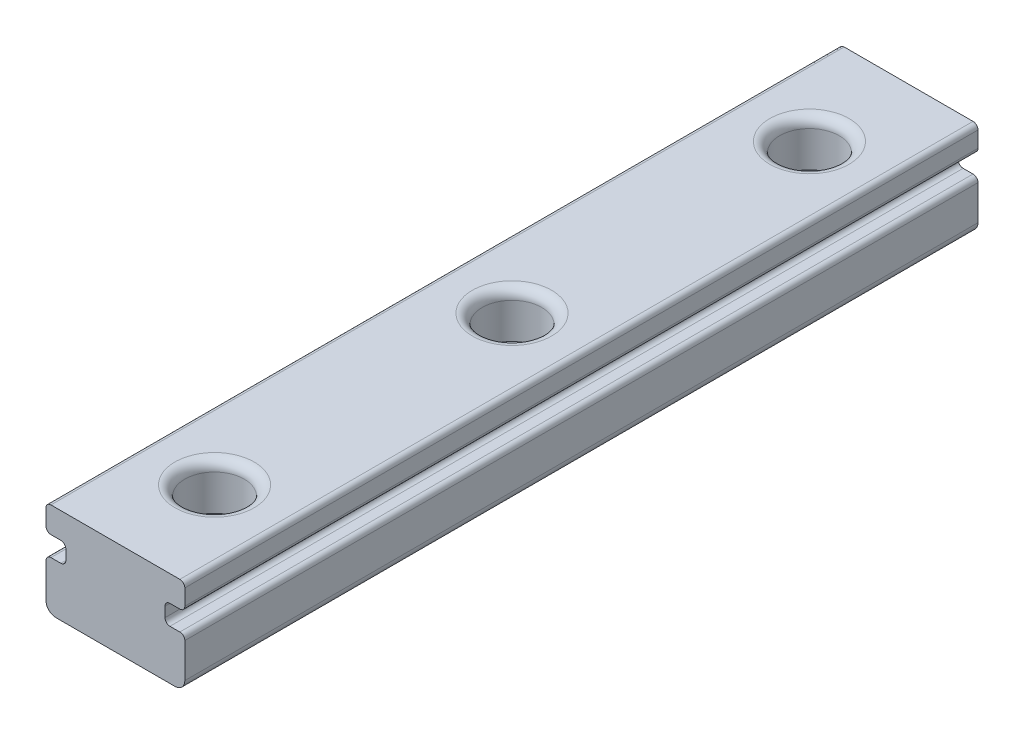
ISO-10303-21;
HEADER;
FILE_DESCRIPTION(('STEP AP214'),'2;1');
FILE_NAME('part.step','',(''),(''),'','','');
FILE_SCHEMA(('AUTOMOTIVE_DESIGN { 1 0 10303 214 1 1 1 1 }'));
ENDSEC;
DATA;
#1=APPLICATION_CONTEXT('core data for automotive mechanical design processes');
#2=APPLICATION_PROTOCOL_DEFINITION('international standard','automotive_design',2000,#1);
#3=PRODUCT_CONTEXT('',#1,'mechanical');
#4=PRODUCT('Part','Part','',(#3));
#5=PRODUCT_RELATED_PRODUCT_CATEGORY('part','',(#4));
#6=PRODUCT_DEFINITION_FORMATION('','',#4);
#7=PRODUCT_DEFINITION_CONTEXT('part definition',#1,'design');
#8=PRODUCT_DEFINITION('design','',#6,#7);
#9=PRODUCT_DEFINITION_SHAPE('','',#8);
#10=(LENGTH_UNIT() NAMED_UNIT(*) SI_UNIT(.MILLI.,.METRE.));
#11=(NAMED_UNIT(*) PLANE_ANGLE_UNIT() SI_UNIT($,.RADIAN.));
#12=(NAMED_UNIT(*) SI_UNIT($,.STERADIAN.) SOLID_ANGLE_UNIT());
#13=UNCERTAINTY_MEASURE_WITH_UNIT(LENGTH_MEASURE(1.E-05),#10,'distance_accuracy_value','');
#14=(GEOMETRIC_REPRESENTATION_CONTEXT(3) GLOBAL_UNCERTAINTY_ASSIGNED_CONTEXT((#13)) GLOBAL_UNIT_ASSIGNED_CONTEXT((#10,
#11,#12)) REPRESENTATION_CONTEXT('',''));
#15=CARTESIAN_POINT('',(0.,0.,0.));
#16=DIRECTION('',(0.,0.,1.));
#17=DIRECTION('',(1.,0.,0.));
#18=AXIS2_PLACEMENT_3D('',#15,#16,#17);
#19=CARTESIAN_POINT('',(3.5,0.,35.));
#20=DIRECTION('',(0.,1.,0.));
#21=DIRECTION('',(0.,0.,1.));
#22=AXIS2_PLACEMENT_3D('',#19,#20,#21);
#23=CYLINDRICAL_SURFACE('',#22,1.2);
#24=CARTESIAN_POINT('',(3.5,0.,35.));
#25=DIRECTION('',(0.,1.,0.));
#26=DIRECTION('',(0.,0.,1.));
#27=AXIS2_PLACEMENT_3D('',#24,#25,#26);
#28=CIRCLE('',#27,1.2);
#29=CARTESIAN_POINT('',(3.5,0.,36.2));
#30=VERTEX_POINT('',#29);
#31=EDGE_CURVE('E337',#30,#30,#28,.T.);
#32=ORIENTED_EDGE('',*,*,#31,.F.);
#33=EDGE_LOOP('',(#32));
#34=FACE_BOUND('',#33,.T.);
#35=CARTESIAN_POINT('',(3.5,2.5,35.));
#36=DIRECTION('',(0.,1.,0.));
#37=DIRECTION('',(0.,0.,1.));
#38=AXIS2_PLACEMENT_3D('',#35,#36,#37);
#39=CIRCLE('',#38,1.2);
#40=CARTESIAN_POINT('',(3.5,2.5,36.2));
#41=VERTEX_POINT('',#40);
#42=EDGE_CURVE('E11',#41,#41,#39,.T.);
#43=ORIENTED_EDGE('',*,*,#42,.T.);
#44=EDGE_LOOP('',(#43));
#45=FACE_BOUND('',#44,.T.);
#46=ADVANCED_FACE('F36',(#34,#45),#23,.F.);
#47=CARTESIAN_POINT('',(3.5,2.5,35.));
#48=DIRECTION('',(0.,1.,0.));
#49=DIRECTION('',(0.,0.,1.));
#50=AXIS2_PLACEMENT_3D('',#47,#48,#49);
#51=PLANE('',#50);
#52=ORIENTED_EDGE('',*,*,#42,.F.);
#53=EDGE_LOOP('',(#52));
#54=FACE_BOUND('',#53,.T.);
#55=CARTESIAN_POINT('',(3.5,2.5,35.));
#56=DIRECTION('',(0.,1.,0.));
#57=DIRECTION('',(0.,0.,1.));
#58=AXIS2_PLACEMENT_3D('',#55,#56,#57);
#59=CIRCLE('',#58,1.5);
#60=CARTESIAN_POINT('',(3.5,2.5,36.5));
#61=VERTEX_POINT('',#60);
#62=EDGE_CURVE('E43',#61,#61,#59,.T.);
#63=ORIENTED_EDGE('',*,*,#62,.T.);
#64=EDGE_LOOP('',(#63));
#65=FACE_BOUND('',#64,.T.);
#66=ADVANCED_FACE('F348',(#54,#65),#51,.T.);
#67=CARTESIAN_POINT('',(3.5,2.5,35.));
#68=DIRECTION('',(0.,1.,0.));
#69=DIRECTION('',(0.,0.,1.));
#70=AXIS2_PLACEMENT_3D('',#67,#68,#69);
#71=CYLINDRICAL_SURFACE('',#70,1.5);
#72=CARTESIAN_POINT('',(3.5,4.3,35.));
#73=DIRECTION('',(0.,1.,0.));
#74=DIRECTION('',(0.,0.,1.));
#75=AXIS2_PLACEMENT_3D('',#72,#73,#74);
#76=CIRCLE('',#75,1.5);
#77=CARTESIAN_POINT('',(3.5,4.3,36.5));
#78=VERTEX_POINT('',#77);
#79=EDGE_CURVE('E343',#78,#78,#76,.T.);
#80=ORIENTED_EDGE('',*,*,#79,.T.);
#81=EDGE_LOOP('',(#80));
#82=FACE_BOUND('',#81,.T.);
#83=ORIENTED_EDGE('',*,*,#62,.F.);
#84=EDGE_LOOP('',(#83));
#85=FACE_BOUND('',#84,.T.);
#86=ADVANCED_FACE('F350',(#82,#85),#71,.F.);
#87=CARTESIAN_POINT('',(3.5,4.3,35.));
#88=DIRECTION('',(0.,1.,0.));
#89=DIRECTION('',(0.,0.,1.));
#90=AXIS2_PLACEMENT_3D('',#87,#88,#89);
#91=TOROIDAL_SURFACE('',#90,2.,0.5);
#92=CARTESIAN_POINT('',(3.5,4.8,35.));
#93=DIRECTION('',(0.,1.,0.));
#94=DIRECTION('',(0.,0.,1.));
#95=AXIS2_PLACEMENT_3D('',#92,#93,#94);
#96=CIRCLE('',#95,2.);
#97=CARTESIAN_POINT('',(3.5,4.8,37.));
#98=VERTEX_POINT('',#97);
#99=EDGE_CURVE('E340',#98,#98,#96,.F.);
#100=ORIENTED_EDGE('',*,*,#99,.F.);
#101=EDGE_LOOP('',(#100));
#102=FACE_BOUND('',#101,.T.);
#103=ORIENTED_EDGE('',*,*,#79,.F.);
#104=EDGE_LOOP('',(#103));
#105=FACE_BOUND('',#104,.T.);
#106=ADVANCED_FACE('F352',(#102,#105),#91,.T.);
#107=CARTESIAN_POINT('',(7.,0.,40.));
#108=DIRECTION('',(1.,0.,0.));
#109=DIRECTION('',(0.,0.,-1.));
#110=AXIS2_PLACEMENT_3D('',#107,#108,#109);
#111=PLANE('',#110);
#112=DIRECTION('',(0.,-1.,0.));
#113=VECTOR('',#112,1.);
#114=CARTESIAN_POINT('',(7.,0.,40.));
#115=LINE('',#114,#113);
#116=CARTESIAN_POINT('',(7.,2.25,40.));
#117=VERTEX_POINT('',#116);
#118=CARTESIAN_POINT('',(7.,0.5,40.));
#119=VERTEX_POINT('',#118);
#120=EDGE_CURVE('E506',#117,#119,#115,.T.);
#121=ORIENTED_EDGE('',*,*,#120,.T.);
#122=DIRECTION('',(0.,0.,-1.));
#123=VECTOR('',#122,1.);
#124=CARTESIAN_POINT('',(7.,0.5,0.));
#125=LINE('',#124,#123);
#126=CARTESIAN_POINT('',(7.,0.5,0.));
#127=VERTEX_POINT('',#126);
#128=EDGE_CURVE('E328',#119,#127,#125,.T.);
#129=ORIENTED_EDGE('',*,*,#128,.T.);
#130=DIRECTION('',(0.,-1.,0.));
#131=VECTOR('',#130,1.);
#132=CARTESIAN_POINT('',(7.,0.,0.));
#133=LINE('',#132,#131);
#134=CARTESIAN_POINT('',(7.,2.25,0.));
#135=VERTEX_POINT('',#134);
#136=EDGE_CURVE('E222',#135,#127,#133,.T.);
#137=ORIENTED_EDGE('',*,*,#136,.F.);
#138=DIRECTION('',(0.,0.,-1.));
#139=VECTOR('',#138,1.);
#140=CARTESIAN_POINT('',(7.,2.25,40.));
#141=LINE('',#140,#139);
#142=EDGE_CURVE('E247',#135,#117,#141,.F.);
#143=ORIENTED_EDGE('',*,*,#142,.T.);
#144=EDGE_LOOP('',(#121,#129,#137,#143));
#145=FACE_BOUND('',#144,.T.);
#146=ADVANCED_FACE('F359',(#145),#111,.T.);
#147=CARTESIAN_POINT('',(0.,2.5,40.));
#148=DIRECTION('',(0.,1.,0.));
#149=DIRECTION('',(0.,0.,1.));
#150=AXIS2_PLACEMENT_3D('',#147,#148,#149);
#151=PLANE('',#150);
#152=DIRECTION('',(1.,0.,0.));
#153=VECTOR('',#152,1.);
#154=CARTESIAN_POINT('',(0.,2.5,40.));
#155=LINE('',#154,#153);
#156=CARTESIAN_POINT('',(6.25,2.5,40.));
#157=VERTEX_POINT('',#156);
#158=CARTESIAN_POINT('',(6.75,2.5,40.));
#159=VERTEX_POINT('',#158);
#160=EDGE_CURVE('E508',#157,#159,#155,.T.);
#161=ORIENTED_EDGE('',*,*,#160,.T.);
#162=DIRECTION('',(0.,0.,-1.));
#163=VECTOR('',#162,1.);
#164=CARTESIAN_POINT('',(6.75,2.5,40.));
#165=LINE('',#164,#163);
#166=CARTESIAN_POINT('',(6.75,2.5,0.));
#167=VERTEX_POINT('',#166);
#168=EDGE_CURVE('E221',#159,#167,#165,.T.);
#169=ORIENTED_EDGE('',*,*,#168,.T.);
#170=DIRECTION('',(1.,0.,0.));
#171=VECTOR('',#170,1.);
#172=CARTESIAN_POINT('',(0.,2.5,0.));
#173=LINE('',#172,#171);
#174=CARTESIAN_POINT('',(6.25,2.5,0.));
#175=VERTEX_POINT('',#174);
#176=EDGE_CURVE('E204',#175,#167,#173,.T.);
#177=ORIENTED_EDGE('',*,*,#176,.F.);
#178=DIRECTION('',(0.,0.,-1.));
#179=VECTOR('',#178,1.);
#180=CARTESIAN_POINT('',(6.25,2.5,40.));
#181=LINE('',#180,#179);
#182=EDGE_CURVE('E218',#175,#157,#181,.F.);
#183=ORIENTED_EDGE('',*,*,#182,.T.);
#184=EDGE_LOOP('',(#161,#169,#177,#183));
#185=FACE_BOUND('',#184,.T.);
#186=ADVANCED_FACE('F217',(#185),#151,.T.);
#187=CARTESIAN_POINT('',(6.,0.,40.));
#188=DIRECTION('',(1.,0.,0.));
#189=DIRECTION('',(0.,0.,-1.));
#190=AXIS2_PLACEMENT_3D('',#187,#188,#189);
#191=PLANE('',#190);
#192=DIRECTION('',(0.,-1.,0.));
#193=VECTOR('',#192,1.);
#194=CARTESIAN_POINT('',(6.,0.,40.));
#195=LINE('',#194,#193);
#196=CARTESIAN_POINT('',(6.,3.25,40.));
#197=VERTEX_POINT('',#196);
#198=CARTESIAN_POINT('',(6.,2.75,40.));
#199=VERTEX_POINT('',#198);
#200=EDGE_CURVE('E510',#197,#199,#195,.T.);
#201=ORIENTED_EDGE('',*,*,#200,.T.);
#202=DIRECTION('',(0.,0.,-1.));
#203=VECTOR('',#202,1.);
#204=CARTESIAN_POINT('',(6.,2.75,0.));
#205=LINE('',#204,#203);
#206=CARTESIAN_POINT('',(6.,2.75,0.));
#207=VERTEX_POINT('',#206);
#208=EDGE_CURVE('E281',#199,#207,#205,.T.);
#209=ORIENTED_EDGE('',*,*,#208,.T.);
#210=DIRECTION('',(0.,-1.,0.));
#211=VECTOR('',#210,1.);
#212=CARTESIAN_POINT('',(6.,0.,0.));
#213=LINE('',#212,#211);
#214=CARTESIAN_POINT('',(6.,3.25,0.));
#215=VERTEX_POINT('',#214);
#216=EDGE_CURVE('E206',#215,#207,#213,.T.);
#217=ORIENTED_EDGE('',*,*,#216,.F.);
#218=DIRECTION('',(0.,0.,-1.));
#219=VECTOR('',#218,1.);
#220=CARTESIAN_POINT('',(6.,3.25,40.));
#221=LINE('',#220,#219);
#222=EDGE_CURVE('E279',#215,#197,#221,.F.);
#223=ORIENTED_EDGE('',*,*,#222,.T.);
#224=EDGE_LOOP('',(#201,#209,#217,#223));
#225=FACE_BOUND('',#224,.T.);
#226=ADVANCED_FACE('F414',(#225),#191,.T.);
#227=CARTESIAN_POINT('',(0.,3.50000000000001,40.));
#228=DIRECTION('',(0.,-1.,0.));
#229=DIRECTION('',(1.,0.,0.));
#230=AXIS2_PLACEMENT_3D('',#227,#228,#229);
#231=PLANE('',#230);
#232=DIRECTION('',(-1.,0.,0.));
#233=VECTOR('',#232,1.);
#234=CARTESIAN_POINT('',(0.,3.50000000000001,40.));
#235=LINE('',#234,#233);
#236=CARTESIAN_POINT('',(6.75,3.5,40.));
#237=VERTEX_POINT('',#236);
#238=CARTESIAN_POINT('',(6.25,3.5,40.));
#239=VERTEX_POINT('',#238);
#240=EDGE_CURVE('E513',#237,#239,#235,.T.);
#241=ORIENTED_EDGE('',*,*,#240,.T.);
#242=DIRECTION('',(0.,0.,-1.));
#243=VECTOR('',#242,1.);
#244=CARTESIAN_POINT('',(6.25,3.5,0.));
#245=LINE('',#244,#243);
#246=CARTESIAN_POINT('',(6.25,3.5,0.));
#247=VERTEX_POINT('',#246);
#248=EDGE_CURVE('E285',#239,#247,#245,.T.);
#249=ORIENTED_EDGE('',*,*,#248,.T.);
#250=DIRECTION('',(-1.,0.,0.));
#251=VECTOR('',#250,1.);
#252=CARTESIAN_POINT('',(0.,3.50000000000001,0.));
#253=LINE('',#252,#251);
#254=CARTESIAN_POINT('',(6.75,3.5,0.));
#255=VERTEX_POINT('',#254);
#256=EDGE_CURVE('E536',#255,#247,#253,.T.);
#257=ORIENTED_EDGE('',*,*,#256,.F.);
#258=DIRECTION('',(0.,0.,-1.));
#259=VECTOR('',#258,1.);
#260=CARTESIAN_POINT('',(6.75,3.5,40.));
#261=LINE('',#260,#259);
#262=EDGE_CURVE('E283',#255,#237,#261,.F.);
#263=ORIENTED_EDGE('',*,*,#262,.T.);
#264=EDGE_LOOP('',(#241,#249,#257,#263));
#265=FACE_BOUND('',#264,.T.);
#266=ADVANCED_FACE('F410',(#265),#231,.T.);
#267=CARTESIAN_POINT('',(7.,0.,40.));
#268=DIRECTION('',(1.,0.,0.));
#269=DIRECTION('',(0.,0.,-1.));
#270=AXIS2_PLACEMENT_3D('',#267,#268,#269);
#271=PLANE('',#270);
#272=DIRECTION('',(0.,-1.,0.));
#273=VECTOR('',#272,1.);
#274=CARTESIAN_POINT('',(7.,0.,0.));
#275=LINE('',#274,#273);
#276=CARTESIAN_POINT('',(7.,4.55,0.));
#277=VERTEX_POINT('',#276);
#278=CARTESIAN_POINT('',(7.,3.75,0.));
#279=VERTEX_POINT('',#278);
#280=EDGE_CURVE('E539',#277,#279,#275,.T.);
#281=ORIENTED_EDGE('',*,*,#280,.F.);
#282=DIRECTION('',(0.,0.,-1.));
#283=VECTOR('',#282,1.);
#284=CARTESIAN_POINT('',(7.,4.55,40.));
#285=LINE('',#284,#283);
#286=CARTESIAN_POINT('',(7.,4.55,40.));
#287=VERTEX_POINT('',#286);
#288=EDGE_CURVE('E296',#277,#287,#285,.F.);
#289=ORIENTED_EDGE('',*,*,#288,.T.);
#290=DIRECTION('',(0.,-1.,0.));
#291=VECTOR('',#290,1.);
#292=CARTESIAN_POINT('',(7.,0.,40.));
#293=LINE('',#292,#291);
#294=CARTESIAN_POINT('',(7.,3.75,40.));
#295=VERTEX_POINT('',#294);
#296=EDGE_CURVE('E516',#287,#295,#293,.T.);
#297=ORIENTED_EDGE('',*,*,#296,.T.);
#298=DIRECTION('',(0.,0.,-1.));
#299=VECTOR('',#298,1.);
#300=CARTESIAN_POINT('',(7.,3.75,40.));
#301=LINE('',#300,#299);
#302=EDGE_CURVE('E293',#295,#279,#301,.T.);
#303=ORIENTED_EDGE('',*,*,#302,.T.);
#304=EDGE_LOOP('',(#281,#289,#297,#303));
#305=FACE_BOUND('',#304,.T.);
#306=ADVANCED_FACE('F406',(#305),#271,.T.);
#307=CARTESIAN_POINT('',(0.,4.8,40.));
#308=DIRECTION('',(0.,1.,0.));
#309=DIRECTION('',(0.,0.,1.));
#310=AXIS2_PLACEMENT_3D('',#307,#308,#309);
#311=PLANE('',#310);
#312=CARTESIAN_POINT('',(3.5,4.8,20.));
#313=DIRECTION('',(0.,1.,0.));
#314=DIRECTION('',(0.,0.,1.));
#315=AXIS2_PLACEMENT_3D('',#312,#313,#314);
#316=CIRCLE('',#315,2.);
#317=CARTESIAN_POINT('',(3.5,4.8,22.));
#318=VERTEX_POINT('',#317);
#319=EDGE_CURVE('E623',#318,#318,#316,.F.);
#320=ORIENTED_EDGE('',*,*,#319,.T.);
#321=EDGE_LOOP('',(#320));
#322=FACE_BOUND('',#321,.T.);
#323=CARTESIAN_POINT('',(3.5,4.8,5.));
#324=DIRECTION('',(0.,1.,0.));
#325=DIRECTION('',(0.,0.,1.));
#326=AXIS2_PLACEMENT_3D('',#323,#324,#325);
#327=CIRCLE('',#326,2.);
#328=CARTESIAN_POINT('',(3.5,4.8,7.));
#329=VERTEX_POINT('',#328);
#330=EDGE_CURVE('E334',#329,#329,#327,.F.);
#331=ORIENTED_EDGE('',*,*,#330,.T.);
#332=EDGE_LOOP('',(#331));
#333=FACE_BOUND('',#332,.T.);
#334=DIRECTION('',(1.,0.,0.));
#335=VECTOR('',#334,1.);
#336=CARTESIAN_POINT('',(0.,4.8,40.));
#337=LINE('',#336,#335);
#338=CARTESIAN_POINT('',(0.25,4.8,40.));
#339=VERTEX_POINT('',#338);
#340=CARTESIAN_POINT('',(6.75,4.8,40.));
#341=VERTEX_POINT('',#340);
#342=EDGE_CURVE('E519',#339,#341,#337,.T.);
#343=ORIENTED_EDGE('',*,*,#342,.T.);
#344=DIRECTION('',(0.,0.,-1.));
#345=VECTOR('',#344,1.);
#346=CARTESIAN_POINT('',(6.75,4.8,40.));
#347=LINE('',#346,#345);
#348=CARTESIAN_POINT('',(6.75,4.8,0.));
#349=VERTEX_POINT('',#348);
#350=EDGE_CURVE('E290',#341,#349,#347,.T.);
#351=ORIENTED_EDGE('',*,*,#350,.T.);
#352=DIRECTION('',(1.,0.,0.));
#353=VECTOR('',#352,1.);
#354=CARTESIAN_POINT('',(0.,4.8,0.));
#355=LINE('',#354,#353);
#356=CARTESIAN_POINT('',(0.25,4.8,0.));
#357=VERTEX_POINT('',#356);
#358=EDGE_CURVE('E542',#357,#349,#355,.T.);
#359=ORIENTED_EDGE('',*,*,#358,.F.);
#360=DIRECTION('',(0.,0.,-1.));
#361=VECTOR('',#360,1.);
#362=CARTESIAN_POINT('',(0.25,4.8,40.));
#363=LINE('',#362,#361);
#364=EDGE_CURVE('E288',#357,#339,#363,.F.);
#365=ORIENTED_EDGE('',*,*,#364,.T.);
#366=EDGE_LOOP('',(#343,#351,#359,#365));
#367=FACE_BOUND('',#366,.T.);
#368=ORIENTED_EDGE('',*,*,#99,.T.);
#369=EDGE_LOOP('',(#368));
#370=FACE_BOUND('',#369,.T.);
#371=ADVANCED_FACE('F402',(#322,#333,#367,#370),#311,.T.);
#372=CARTESIAN_POINT('',(0.,0.,40.));
#373=DIRECTION('',(-1.,0.,0.));
#374=DIRECTION('',(0.,0.,1.));
#375=AXIS2_PLACEMENT_3D('',#372,#373,#374);
#376=PLANE('',#375);
#377=DIRECTION('',(0.,1.,0.));
#378=VECTOR('',#377,1.);
#379=CARTESIAN_POINT('',(0.,0.,40.));
#380=LINE('',#379,#378);
#381=CARTESIAN_POINT('',(0.,3.75,40.));
#382=VERTEX_POINT('',#381);
#383=CARTESIAN_POINT('',(0.,4.55,40.));
#384=VERTEX_POINT('',#383);
#385=EDGE_CURVE('E522',#382,#384,#380,.T.);
#386=ORIENTED_EDGE('',*,*,#385,.T.);
#387=DIRECTION('',(0.,0.,-1.));
#388=VECTOR('',#387,1.);
#389=CARTESIAN_POINT('',(0.,4.55,40.));
#390=LINE('',#389,#388);
#391=CARTESIAN_POINT('',(0.,4.55,0.));
#392=VERTEX_POINT('',#391);
#393=EDGE_CURVE('E300',#384,#392,#390,.T.);
#394=ORIENTED_EDGE('',*,*,#393,.T.);
#395=DIRECTION('',(0.,1.,0.));
#396=VECTOR('',#395,1.);
#397=CARTESIAN_POINT('',(0.,0.,0.));
#398=LINE('',#397,#396);
#399=CARTESIAN_POINT('',(0.,3.75,0.));
#400=VERTEX_POINT('',#399);
#401=EDGE_CURVE('E545',#400,#392,#398,.T.);
#402=ORIENTED_EDGE('',*,*,#401,.F.);
#403=DIRECTION('',(0.,0.,-1.));
#404=VECTOR('',#403,1.);
#405=CARTESIAN_POINT('',(0.,3.75,40.));
#406=LINE('',#405,#404);
#407=EDGE_CURVE('E298',#400,#382,#406,.F.);
#408=ORIENTED_EDGE('',*,*,#407,.T.);
#409=EDGE_LOOP('',(#386,#394,#402,#408));
#410=FACE_BOUND('',#409,.T.);
#411=ADVANCED_FACE('F398',(#410),#376,.T.);
#412=CARTESIAN_POINT('',(0.,3.5,40.));
#413=DIRECTION('',(0.,-1.,0.));
#414=DIRECTION('',(0.,0.,-1.));
#415=AXIS2_PLACEMENT_3D('',#412,#413,#414);
#416=PLANE('',#415);
#417=DIRECTION('',(-1.,0.,0.));
#418=VECTOR('',#417,1.);
#419=CARTESIAN_POINT('',(0.,3.5,0.));
#420=LINE('',#419,#418);
#421=CARTESIAN_POINT('',(0.75,3.5,0.));
#422=VERTEX_POINT('',#421);
#423=CARTESIAN_POINT('',(0.25,3.5,0.));
#424=VERTEX_POINT('',#423);
#425=EDGE_CURVE('E548',#422,#424,#420,.T.);
#426=ORIENTED_EDGE('',*,*,#425,.F.);
#427=DIRECTION('',(0.,0.,-1.));
#428=VECTOR('',#427,1.);
#429=CARTESIAN_POINT('',(0.75,3.5,40.));
#430=LINE('',#429,#428);
#431=CARTESIAN_POINT('',(0.75,3.5,40.));
#432=VERTEX_POINT('',#431);
#433=EDGE_CURVE('E277',#422,#432,#430,.F.);
#434=ORIENTED_EDGE('',*,*,#433,.T.);
#435=DIRECTION('',(-1.,0.,0.));
#436=VECTOR('',#435,1.);
#437=CARTESIAN_POINT('',(0.,3.5,40.));
#438=LINE('',#437,#436);
#439=CARTESIAN_POINT('',(0.25,3.5,40.));
#440=VERTEX_POINT('',#439);
#441=EDGE_CURVE('E525',#432,#440,#438,.T.);
#442=ORIENTED_EDGE('',*,*,#441,.T.);
#443=DIRECTION('',(0.,0.,-1.));
#444=VECTOR('',#443,1.);
#445=CARTESIAN_POINT('',(0.25,3.5,40.));
#446=LINE('',#445,#444);
#447=EDGE_CURVE('E274',#440,#424,#446,.T.);
#448=ORIENTED_EDGE('',*,*,#447,.T.);
#449=EDGE_LOOP('',(#426,#434,#442,#448));
#450=FACE_BOUND('',#449,.T.);
#451=ADVANCED_FACE('F394',(#450),#416,.T.);
#452=CARTESIAN_POINT('',(1.,0.,40.));
#453=DIRECTION('',(-1.,0.,0.));
#454=DIRECTION('',(0.,0.,1.));
#455=AXIS2_PLACEMENT_3D('',#452,#453,#454);
#456=PLANE('',#455);
#457=DIRECTION('',(0.,1.,0.));
#458=VECTOR('',#457,1.);
#459=CARTESIAN_POINT('',(1.,0.,40.));
#460=LINE('',#459,#458);
#461=CARTESIAN_POINT('',(1.,2.75,40.));
#462=VERTEX_POINT('',#461);
#463=CARTESIAN_POINT('',(1.,3.25,40.));
#464=VERTEX_POINT('',#463);
#465=EDGE_CURVE('E528',#462,#464,#460,.T.);
#466=ORIENTED_EDGE('',*,*,#465,.T.);
#467=DIRECTION('',(0.,0.,-1.));
#468=VECTOR('',#467,1.);
#469=CARTESIAN_POINT('',(1.,3.25,0.));
#470=LINE('',#469,#468);
#471=CARTESIAN_POINT('',(1.,3.25,0.));
#472=VERTEX_POINT('',#471);
#473=EDGE_CURVE('E271',#464,#472,#470,.T.);
#474=ORIENTED_EDGE('',*,*,#473,.T.);
#475=DIRECTION('',(0.,1.,0.));
#476=VECTOR('',#475,1.);
#477=CARTESIAN_POINT('',(1.,0.,0.));
#478=LINE('',#477,#476);
#479=CARTESIAN_POINT('',(1.,2.75,0.));
#480=VERTEX_POINT('',#479);
#481=EDGE_CURVE('E551',#480,#472,#478,.T.);
#482=ORIENTED_EDGE('',*,*,#481,.F.);
#483=DIRECTION('',(0.,0.,-1.));
#484=VECTOR('',#483,1.);
#485=CARTESIAN_POINT('',(1.,2.75,40.));
#486=LINE('',#485,#484);
#487=EDGE_CURVE('E269',#480,#462,#486,.F.);
#488=ORIENTED_EDGE('',*,*,#487,.T.);
#489=EDGE_LOOP('',(#466,#474,#482,#488));
#490=FACE_BOUND('',#489,.T.);
#491=ADVANCED_FACE('F390',(#490),#456,.T.);
#492=CARTESIAN_POINT('',(0.,2.5,40.));
#493=DIRECTION('',(0.,1.,0.));
#494=DIRECTION('',(0.,0.,1.));
#495=AXIS2_PLACEMENT_3D('',#492,#493,#494);
#496=PLANE('',#495);
#497=DIRECTION('',(1.,0.,0.));
#498=VECTOR('',#497,1.);
#499=CARTESIAN_POINT('',(0.,2.5,0.));
#500=LINE('',#499,#498);
#501=CARTESIAN_POINT('',(0.25,2.5,0.));
#502=VERTEX_POINT('',#501);
#503=CARTESIAN_POINT('',(0.75,2.5,0.));
#504=VERTEX_POINT('',#503);
#505=EDGE_CURVE('E554',#502,#504,#500,.T.);
#506=ORIENTED_EDGE('',*,*,#505,.F.);
#507=DIRECTION('',(0.,0.,-1.));
#508=VECTOR('',#507,1.);
#509=CARTESIAN_POINT('',(0.25,2.5,40.));
#510=LINE('',#509,#508);
#511=CARTESIAN_POINT('',(0.25,2.5,40.));
#512=VERTEX_POINT('',#511);
#513=EDGE_CURVE('E267',#502,#512,#510,.F.);
#514=ORIENTED_EDGE('',*,*,#513,.T.);
#515=DIRECTION('',(1.,0.,0.));
#516=VECTOR('',#515,1.);
#517=CARTESIAN_POINT('',(0.,2.5,40.));
#518=LINE('',#517,#516);
#519=CARTESIAN_POINT('',(0.75,2.5,40.));
#520=VERTEX_POINT('',#519);
#521=EDGE_CURVE('E531',#512,#520,#518,.T.);
#522=ORIENTED_EDGE('',*,*,#521,.T.);
#523=DIRECTION('',(0.,0.,-1.));
#524=VECTOR('',#523,1.);
#525=CARTESIAN_POINT('',(0.75,2.5,0.));
#526=LINE('',#525,#524);
#527=EDGE_CURVE('E264',#520,#504,#526,.T.);
#528=ORIENTED_EDGE('',*,*,#527,.T.);
#529=EDGE_LOOP('',(#506,#514,#522,#528));
#530=FACE_BOUND('',#529,.T.);
#531=ADVANCED_FACE('F382',(#530),#496,.T.);
#532=CARTESIAN_POINT('',(0.,0.,40.));
#533=DIRECTION('',(1.,0.,0.));
#534=DIRECTION('',(0.,1.,0.));
#535=AXIS2_PLACEMENT_3D('',#532,#533,#534);
#536=PLANE('',#535);
#537=DIRECTION('',(0.,-1.,0.));
#538=VECTOR('',#537,1.);
#539=CARTESIAN_POINT('',(0.,0.,0.));
#540=LINE('',#539,#538);
#541=CARTESIAN_POINT('',(0.,2.25,0.));
#542=VERTEX_POINT('',#541);
#543=CARTESIAN_POINT('',(0.,0.5,0.));
#544=VERTEX_POINT('',#543);
#545=EDGE_CURVE('E556',#542,#544,#540,.T.);
#546=ORIENTED_EDGE('',*,*,#545,.T.);
#547=DIRECTION('',(0.,0.,-1.));
#548=VECTOR('',#547,1.);
#549=CARTESIAN_POINT('',(0.,0.5,40.));
#550=LINE('',#549,#548);
#551=CARTESIAN_POINT('',(0.,0.5,40.));
#552=VERTEX_POINT('',#551);
#553=EDGE_CURVE('E58',#544,#552,#550,.F.);
#554=ORIENTED_EDGE('',*,*,#553,.T.);
#555=DIRECTION('',(0.,-1.,0.));
#556=VECTOR('',#555,1.);
#557=CARTESIAN_POINT('',(0.,0.,40.));
#558=LINE('',#557,#556);
#559=CARTESIAN_POINT('',(0.,2.25,40.));
#560=VERTEX_POINT('',#559);
#561=EDGE_CURVE('E230',#560,#552,#558,.T.);
#562=ORIENTED_EDGE('',*,*,#561,.F.);
#563=DIRECTION('',(0.,0.,-1.));
#564=VECTOR('',#563,1.);
#565=CARTESIAN_POINT('',(0.,2.25,0.));
#566=LINE('',#565,#564);
#567=EDGE_CURVE('E261',#560,#542,#566,.T.);
#568=ORIENTED_EDGE('',*,*,#567,.T.);
#569=EDGE_LOOP('',(#546,#554,#562,#568));
#570=FACE_BOUND('',#569,.T.);
#571=ADVANCED_FACE('F374',(#570),#536,.F.);
#572=CARTESIAN_POINT('',(0.,0.,40.));
#573=DIRECTION('',(0.,1.,0.));
#574=DIRECTION('',(0.,0.,1.));
#575=AXIS2_PLACEMENT_3D('',#572,#573,#574);
#576=PLANE('',#575);
#577=CARTESIAN_POINT('',(3.5,0.,20.));
#578=DIRECTION('',(0.,1.,0.));
#579=DIRECTION('',(0.,0.,1.));
#580=AXIS2_PLACEMENT_3D('',#577,#578,#579);
#581=CIRCLE('',#580,1.2);
#582=CARTESIAN_POINT('',(3.5,0.,21.2));
#583=VERTEX_POINT('',#582);
#584=EDGE_CURVE('E626',#583,#583,#581,.T.);
#585=ORIENTED_EDGE('',*,*,#584,.T.);
#586=EDGE_LOOP('',(#585));
#587=FACE_BOUND('',#586,.T.);
#588=CARTESIAN_POINT('',(3.5,0.,5.));
#589=DIRECTION('',(0.,1.,0.));
#590=DIRECTION('',(0.,0.,1.));
#591=AXIS2_PLACEMENT_3D('',#588,#589,#590);
#592=CIRCLE('',#591,1.2);
#593=CARTESIAN_POINT('',(3.5,0.,6.2));
#594=VERTEX_POINT('',#593);
#595=EDGE_CURVE('E497',#594,#594,#592,.T.);
#596=ORIENTED_EDGE('',*,*,#595,.T.);
#597=EDGE_LOOP('',(#596));
#598=FACE_BOUND('',#597,.T.);
#599=DIRECTION('',(1.,0.,0.));
#600=VECTOR('',#599,1.);
#601=CARTESIAN_POINT('',(0.,0.,40.));
#602=LINE('',#601,#600);
#603=CARTESIAN_POINT('',(0.5,0.,40.));
#604=VERTEX_POINT('',#603);
#605=CARTESIAN_POINT('',(6.5,0.,40.));
#606=VERTEX_POINT('',#605);
#607=EDGE_CURVE('E226',#604,#606,#602,.T.);
#608=ORIENTED_EDGE('',*,*,#607,.F.);
#609=DIRECTION('',(0.,0.,-1.));
#610=VECTOR('',#609,1.);
#611=CARTESIAN_POINT('',(0.5,0.,40.));
#612=LINE('',#611,#610);
#613=CARTESIAN_POINT('',(0.5,0.,0.));
#614=VERTEX_POINT('',#613);
#615=EDGE_CURVE('E317',#604,#614,#612,.T.);
#616=ORIENTED_EDGE('',*,*,#615,.T.);
#617=DIRECTION('',(1.,0.,0.));
#618=VECTOR('',#617,1.);
#619=CARTESIAN_POINT('',(0.,0.,0.));
#620=LINE('',#619,#618);
#621=CARTESIAN_POINT('',(6.5,0.,0.));
#622=VERTEX_POINT('',#621);
#623=EDGE_CURVE('E233',#614,#622,#620,.T.);
#624=ORIENTED_EDGE('',*,*,#623,.T.);
#625=DIRECTION('',(0.,0.,-1.));
#626=VECTOR('',#625,1.);
#627=CARTESIAN_POINT('',(6.5,0.,40.));
#628=LINE('',#627,#626);
#629=EDGE_CURVE('E315',#622,#606,#628,.F.);
#630=ORIENTED_EDGE('',*,*,#629,.T.);
#631=EDGE_LOOP('',(#608,#616,#624,#630));
#632=FACE_BOUND('',#631,.T.);
#633=ORIENTED_EDGE('',*,*,#31,.T.);
#634=EDGE_LOOP('',(#633));
#635=FACE_BOUND('',#634,.T.);
#636=ADVANCED_FACE('F371',(#587,#598,#632,#635),#576,.F.);
#637=CARTESIAN_POINT('',(0.,0.,40.));
#638=DIRECTION('',(0.,0.,1.));
#639=DIRECTION('',(1.,0.,0.));
#640=AXIS2_PLACEMENT_3D('',#637,#638,#639);
#641=PLANE('',#640);
#642=ORIENTED_EDGE('',*,*,#561,.T.);
#643=CARTESIAN_POINT('',(0.5,0.5,40.));
#644=DIRECTION('',(0.,0.,1.));
#645=DIRECTION('',(1.,0.,0.));
#646=AXIS2_PLACEMENT_3D('',#643,#644,#645);
#647=CIRCLE('',#646,0.5);
#648=EDGE_CURVE('E326',#552,#604,#647,.T.);
#649=ORIENTED_EDGE('',*,*,#648,.T.);
#650=ORIENTED_EDGE('',*,*,#607,.T.);
#651=CARTESIAN_POINT('',(6.5,0.5,40.));
#652=DIRECTION('',(0.,0.,1.));
#653=DIRECTION('',(1.,0.,0.));
#654=AXIS2_PLACEMENT_3D('',#651,#652,#653);
#655=CIRCLE('',#654,0.5);
#656=EDGE_CURVE('E50',#606,#119,#655,.T.);
#657=ORIENTED_EDGE('',*,*,#656,.T.);
#658=ORIENTED_EDGE('',*,*,#120,.F.);
#659=CARTESIAN_POINT('',(6.75,2.25,40.));
#660=DIRECTION('',(0.,0.,1.));
#661=DIRECTION('',(1.,0.,0.));
#662=AXIS2_PLACEMENT_3D('',#659,#660,#661);
#663=CIRCLE('',#662,0.25);
#664=EDGE_CURVE('E259',#117,#159,#663,.T.);
#665=ORIENTED_EDGE('',*,*,#664,.T.);
#666=ORIENTED_EDGE('',*,*,#160,.F.);
#667=CARTESIAN_POINT('',(6.25,2.75,40.));
#668=DIRECTION('',(0.,0.,1.));
#669=DIRECTION('',(1.,0.,0.));
#670=AXIS2_PLACEMENT_3D('',#667,#668,#669);
#671=CIRCLE('',#670,0.25);
#672=EDGE_CURVE('E211',#157,#199,#671,.F.);
#673=ORIENTED_EDGE('',*,*,#672,.T.);
#674=ORIENTED_EDGE('',*,*,#200,.F.);
#675=CARTESIAN_POINT('',(6.25,3.25,40.));
#676=DIRECTION('',(0.,0.,1.));
#677=DIRECTION('',(1.,0.,0.));
#678=AXIS2_PLACEMENT_3D('',#675,#676,#677);
#679=CIRCLE('',#678,0.25);
#680=EDGE_CURVE('E313',#197,#239,#679,.F.);
#681=ORIENTED_EDGE('',*,*,#680,.T.);
#682=ORIENTED_EDGE('',*,*,#240,.F.);
#683=CARTESIAN_POINT('',(6.75,3.75,40.));
#684=DIRECTION('',(0.,0.,1.));
#685=DIRECTION('',(1.,0.,0.));
#686=AXIS2_PLACEMENT_3D('',#683,#684,#685);
#687=CIRCLE('',#686,0.25);
#688=EDGE_CURVE('E249',#237,#295,#687,.T.);
#689=ORIENTED_EDGE('',*,*,#688,.T.);
#690=ORIENTED_EDGE('',*,*,#296,.F.);
#691=CARTESIAN_POINT('',(6.75,4.55,40.));
#692=DIRECTION('',(0.,0.,1.));
#693=DIRECTION('',(1.,0.,0.));
#694=AXIS2_PLACEMENT_3D('',#691,#692,#693);
#695=CIRCLE('',#694,0.25);
#696=EDGE_CURVE('E255',#287,#341,#695,.T.);
#697=ORIENTED_EDGE('',*,*,#696,.T.);
#698=ORIENTED_EDGE('',*,*,#342,.F.);
#699=CARTESIAN_POINT('',(0.25,4.55,40.));
#700=DIRECTION('',(0.,0.,1.));
#701=DIRECTION('',(1.,0.,0.));
#702=AXIS2_PLACEMENT_3D('',#699,#700,#701);
#703=CIRCLE('',#702,0.25);
#704=EDGE_CURVE('E253',#339,#384,#703,.T.);
#705=ORIENTED_EDGE('',*,*,#704,.T.);
#706=ORIENTED_EDGE('',*,*,#385,.F.);
#707=CARTESIAN_POINT('',(0.25,3.75,40.));
#708=DIRECTION('',(0.,0.,1.));
#709=DIRECTION('',(1.,0.,0.));
#710=AXIS2_PLACEMENT_3D('',#707,#708,#709);
#711=CIRCLE('',#710,0.25);
#712=EDGE_CURVE('E251',#382,#440,#711,.T.);
#713=ORIENTED_EDGE('',*,*,#712,.T.);
#714=ORIENTED_EDGE('',*,*,#441,.F.);
#715=CARTESIAN_POINT('',(0.75,3.25,40.));
#716=DIRECTION('',(0.,0.,1.));
#717=DIRECTION('',(1.,0.,0.));
#718=AXIS2_PLACEMENT_3D('',#715,#716,#717);
#719=CIRCLE('',#718,0.25);
#720=EDGE_CURVE('E305',#432,#464,#719,.F.);
#721=ORIENTED_EDGE('',*,*,#720,.T.);
#722=ORIENTED_EDGE('',*,*,#465,.F.);
#723=CARTESIAN_POINT('',(0.75,2.75,40.));
#724=DIRECTION('',(0.,0.,1.));
#725=DIRECTION('',(1.,0.,0.));
#726=AXIS2_PLACEMENT_3D('',#723,#724,#725);
#727=CIRCLE('',#726,0.25);
#728=EDGE_CURVE('E212',#462,#520,#727,.F.);
#729=ORIENTED_EDGE('',*,*,#728,.T.);
#730=ORIENTED_EDGE('',*,*,#521,.F.);
#731=CARTESIAN_POINT('',(0.25,2.25,40.));
#732=DIRECTION('',(0.,0.,1.));
#733=DIRECTION('',(1.,0.,0.));
#734=AXIS2_PLACEMENT_3D('',#731,#732,#733);
#735=CIRCLE('',#734,0.25);
#736=EDGE_CURVE('E257',#512,#560,#735,.T.);
#737=ORIENTED_EDGE('',*,*,#736,.T.);
#738=EDGE_LOOP('',(#642,#649,#650,#657,#658,#665,#666,#673,#674,#681,#682,#689,#690,#697,#698,
#705,#706,#713,#714,#721,#722,#729,#730,#737));
#739=FACE_BOUND('',#738,.T.);
#740=ADVANCED_FACE('F373',(#739),#641,.T.);
#741=CARTESIAN_POINT('',(0.,0.,0.));
#742=DIRECTION('',(0.,0.,1.));
#743=DIRECTION('',(1.,0.,0.));
#744=AXIS2_PLACEMENT_3D('',#741,#742,#743);
#745=PLANE('',#744);
#746=ORIENTED_EDGE('',*,*,#623,.F.);
#747=CARTESIAN_POINT('',(0.5,0.5,0.));
#748=DIRECTION('',(0.,0.,1.));
#749=DIRECTION('',(1.,0.,0.));
#750=AXIS2_PLACEMENT_3D('',#747,#748,#749);
#751=CIRCLE('',#750,0.5);
#752=EDGE_CURVE('E322',#614,#544,#751,.F.);
#753=ORIENTED_EDGE('',*,*,#752,.T.);
#754=ORIENTED_EDGE('',*,*,#545,.F.);
#755=CARTESIAN_POINT('',(0.25,2.25,0.));
#756=DIRECTION('',(0.,0.,1.));
#757=DIRECTION('',(1.,0.,0.));
#758=AXIS2_PLACEMENT_3D('',#755,#756,#757);
#759=CIRCLE('',#758,0.25);
#760=EDGE_CURVE('E243',#542,#502,#759,.F.);
#761=ORIENTED_EDGE('',*,*,#760,.T.);
#762=ORIENTED_EDGE('',*,*,#505,.T.);
#763=CARTESIAN_POINT('',(0.75,2.75,0.));
#764=DIRECTION('',(0.,0.,1.));
#765=DIRECTION('',(1.,0.,0.));
#766=AXIS2_PLACEMENT_3D('',#763,#764,#765);
#767=CIRCLE('',#766,0.25);
#768=EDGE_CURVE('E307',#504,#480,#767,.T.);
#769=ORIENTED_EDGE('',*,*,#768,.T.);
#770=ORIENTED_EDGE('',*,*,#481,.T.);
#771=CARTESIAN_POINT('',(0.75,3.25,0.));
#772=DIRECTION('',(0.,0.,1.));
#773=DIRECTION('',(1.,0.,0.));
#774=AXIS2_PLACEMENT_3D('',#771,#772,#773);
#775=CIRCLE('',#774,0.25);
#776=EDGE_CURVE('E303',#472,#422,#775,.T.);
#777=ORIENTED_EDGE('',*,*,#776,.T.);
#778=ORIENTED_EDGE('',*,*,#425,.T.);
#779=CARTESIAN_POINT('',(0.25,3.75,0.));
#780=DIRECTION('',(0.,0.,1.));
#781=DIRECTION('',(1.,0.,0.));
#782=AXIS2_PLACEMENT_3D('',#779,#780,#781);
#783=CIRCLE('',#782,0.25);
#784=EDGE_CURVE('E237',#424,#400,#783,.F.);
#785=ORIENTED_EDGE('',*,*,#784,.T.);
#786=ORIENTED_EDGE('',*,*,#401,.T.);
#787=CARTESIAN_POINT('',(0.25,4.55,0.));
#788=DIRECTION('',(0.,0.,1.));
#789=DIRECTION('',(1.,0.,0.));
#790=AXIS2_PLACEMENT_3D('',#787,#788,#789);
#791=CIRCLE('',#790,0.25);
#792=EDGE_CURVE('E239',#392,#357,#791,.F.);
#793=ORIENTED_EDGE('',*,*,#792,.T.);
#794=ORIENTED_EDGE('',*,*,#358,.T.);
#795=CARTESIAN_POINT('',(6.75,4.55,0.));
#796=DIRECTION('',(0.,0.,1.));
#797=DIRECTION('',(1.,0.,0.));
#798=AXIS2_PLACEMENT_3D('',#795,#796,#797);
#799=CIRCLE('',#798,0.25);
#800=EDGE_CURVE('E241',#349,#277,#799,.F.);
#801=ORIENTED_EDGE('',*,*,#800,.T.);
#802=ORIENTED_EDGE('',*,*,#280,.T.);
#803=CARTESIAN_POINT('',(6.75,3.75,0.));
#804=DIRECTION('',(0.,0.,1.));
#805=DIRECTION('',(1.,0.,0.));
#806=AXIS2_PLACEMENT_3D('',#803,#804,#805);
#807=CIRCLE('',#806,0.25);
#808=EDGE_CURVE('E228',#279,#255,#807,.F.);
#809=ORIENTED_EDGE('',*,*,#808,.T.);
#810=ORIENTED_EDGE('',*,*,#256,.T.);
#811=CARTESIAN_POINT('',(6.25,3.25,0.));
#812=DIRECTION('',(0.,0.,1.));
#813=DIRECTION('',(1.,0.,0.));
#814=AXIS2_PLACEMENT_3D('',#811,#812,#813);
#815=CIRCLE('',#814,0.25);
#816=EDGE_CURVE('E311',#247,#215,#815,.T.);
#817=ORIENTED_EDGE('',*,*,#816,.T.);
#818=ORIENTED_EDGE('',*,*,#216,.T.);
#819=CARTESIAN_POINT('',(6.25,2.75,0.));
#820=DIRECTION('',(0.,0.,1.));
#821=DIRECTION('',(1.,0.,0.));
#822=AXIS2_PLACEMENT_3D('',#819,#820,#821);
#823=CIRCLE('',#822,0.25);
#824=EDGE_CURVE('E200',#207,#175,#823,.T.);
#825=ORIENTED_EDGE('',*,*,#824,.T.);
#826=ORIENTED_EDGE('',*,*,#176,.T.);
#827=CARTESIAN_POINT('',(6.75,2.25,0.));
#828=DIRECTION('',(0.,0.,1.));
#829=DIRECTION('',(1.,0.,0.));
#830=AXIS2_PLACEMENT_3D('',#827,#828,#829);
#831=CIRCLE('',#830,0.25);
#832=EDGE_CURVE('E245',#167,#135,#831,.F.);
#833=ORIENTED_EDGE('',*,*,#832,.T.);
#834=ORIENTED_EDGE('',*,*,#136,.T.);
#835=CARTESIAN_POINT('',(6.5,0.5,0.));
#836=DIRECTION('',(0.,0.,1.));
#837=DIRECTION('',(1.,0.,0.));
#838=AXIS2_PLACEMENT_3D('',#835,#836,#837);
#839=CIRCLE('',#838,0.5);
#840=EDGE_CURVE('E320',#127,#622,#839,.F.);
#841=ORIENTED_EDGE('',*,*,#840,.T.);
#842=EDGE_LOOP('',(#746,#753,#754,#761,#762,#769,#770,#777,#778,#785,#786,#793,#794,#801,#802,
#809,#810,#817,#818,#825,#826,#833,#834,#841));
#843=FACE_BOUND('',#842,.T.);
#844=ADVANCED_FACE('F203',(#843),#745,.F.);
#845=CARTESIAN_POINT('',(6.75,2.25,40.));
#846=DIRECTION('',(0.,0.,-1.));
#847=DIRECTION('',(-1.,0.,0.));
#848=AXIS2_PLACEMENT_3D('',#845,#846,#847);
#849=CYLINDRICAL_SURFACE('',#848,0.25);
#850=ORIENTED_EDGE('',*,*,#664,.F.);
#851=ORIENTED_EDGE('',*,*,#142,.F.);
#852=ORIENTED_EDGE('',*,*,#832,.F.);
#853=ORIENTED_EDGE('',*,*,#168,.F.);
#854=EDGE_LOOP('',(#850,#851,#852,#853));
#855=FACE_BOUND('',#854,.T.);
#856=ADVANCED_FACE('F424',(#855),#849,.T.);
#857=CARTESIAN_POINT('',(0.25,2.25,40.));
#858=DIRECTION('',(0.,0.,1.));
#859=DIRECTION('',(1.,0.,0.));
#860=AXIS2_PLACEMENT_3D('',#857,#858,#859);
#861=CYLINDRICAL_SURFACE('',#860,0.25);
#862=ORIENTED_EDGE('',*,*,#736,.F.);
#863=ORIENTED_EDGE('',*,*,#513,.F.);
#864=ORIENTED_EDGE('',*,*,#760,.F.);
#865=ORIENTED_EDGE('',*,*,#567,.F.);
#866=EDGE_LOOP('',(#862,#863,#864,#865));
#867=FACE_BOUND('',#866,.T.);
#868=ADVANCED_FACE('F427',(#867),#861,.T.);
#869=CARTESIAN_POINT('',(0.75,3.25,40.));
#870=DIRECTION('',(0.,0.,1.));
#871=DIRECTION('',(1.,0.,0.));
#872=AXIS2_PLACEMENT_3D('',#869,#870,#871);
#873=CYLINDRICAL_SURFACE('',#872,0.25);
#874=ORIENTED_EDGE('',*,*,#720,.F.);
#875=ORIENTED_EDGE('',*,*,#433,.F.);
#876=ORIENTED_EDGE('',*,*,#776,.F.);
#877=ORIENTED_EDGE('',*,*,#473,.F.);
#878=EDGE_LOOP('',(#874,#875,#876,#877));
#879=FACE_BOUND('',#878,.T.);
#880=ADVANCED_FACE('F431',(#879),#873,.F.);
#881=CARTESIAN_POINT('',(0.75,2.75,40.));
#882=DIRECTION('',(0.,0.,1.));
#883=DIRECTION('',(1.,0.,0.));
#884=AXIS2_PLACEMENT_3D('',#881,#882,#883);
#885=CYLINDRICAL_SURFACE('',#884,0.25);
#886=ORIENTED_EDGE('',*,*,#728,.F.);
#887=ORIENTED_EDGE('',*,*,#487,.F.);
#888=ORIENTED_EDGE('',*,*,#768,.F.);
#889=ORIENTED_EDGE('',*,*,#527,.F.);
#890=EDGE_LOOP('',(#886,#887,#888,#889));
#891=FACE_BOUND('',#890,.T.);
#892=ADVANCED_FACE('F435',(#891),#885,.F.);
#893=CARTESIAN_POINT('',(6.25,2.75,40.));
#894=DIRECTION('',(0.,0.,1.));
#895=DIRECTION('',(1.,0.,0.));
#896=AXIS2_PLACEMENT_3D('',#893,#894,#895);
#897=CYLINDRICAL_SURFACE('',#896,0.25);
#898=ORIENTED_EDGE('',*,*,#672,.F.);
#899=ORIENTED_EDGE('',*,*,#182,.F.);
#900=ORIENTED_EDGE('',*,*,#824,.F.);
#901=ORIENTED_EDGE('',*,*,#208,.F.);
#902=EDGE_LOOP('',(#898,#899,#900,#901));
#903=FACE_BOUND('',#902,.T.);
#904=ADVANCED_FACE('F225',(#903),#897,.F.);
#905=CARTESIAN_POINT('',(6.25,3.25,40.));
#906=DIRECTION('',(0.,0.,1.));
#907=DIRECTION('',(1.,0.,0.));
#908=AXIS2_PLACEMENT_3D('',#905,#906,#907);
#909=CYLINDRICAL_SURFACE('',#908,0.25);
#910=ORIENTED_EDGE('',*,*,#680,.F.);
#911=ORIENTED_EDGE('',*,*,#222,.F.);
#912=ORIENTED_EDGE('',*,*,#816,.F.);
#913=ORIENTED_EDGE('',*,*,#248,.F.);
#914=EDGE_LOOP('',(#910,#911,#912,#913));
#915=FACE_BOUND('',#914,.T.);
#916=ADVANCED_FACE('F442',(#915),#909,.F.);
#917=CARTESIAN_POINT('',(6.75,4.55,40.));
#918=DIRECTION('',(0.,0.,-1.));
#919=DIRECTION('',(-1.,0.,0.));
#920=AXIS2_PLACEMENT_3D('',#917,#918,#919);
#921=CYLINDRICAL_SURFACE('',#920,0.25);
#922=ORIENTED_EDGE('',*,*,#696,.F.);
#923=ORIENTED_EDGE('',*,*,#288,.F.);
#924=ORIENTED_EDGE('',*,*,#800,.F.);
#925=ORIENTED_EDGE('',*,*,#350,.F.);
#926=EDGE_LOOP('',(#922,#923,#924,#925));
#927=FACE_BOUND('',#926,.T.);
#928=ADVANCED_FACE('F445',(#927),#921,.T.);
#929=CARTESIAN_POINT('',(0.25,4.55,40.));
#930=DIRECTION('',(0.,0.,-1.));
#931=DIRECTION('',(-1.,0.,0.));
#932=AXIS2_PLACEMENT_3D('',#929,#930,#931);
#933=CYLINDRICAL_SURFACE('',#932,0.25);
#934=ORIENTED_EDGE('',*,*,#704,.F.);
#935=ORIENTED_EDGE('',*,*,#364,.F.);
#936=ORIENTED_EDGE('',*,*,#792,.F.);
#937=ORIENTED_EDGE('',*,*,#393,.F.);
#938=EDGE_LOOP('',(#934,#935,#936,#937));
#939=FACE_BOUND('',#938,.T.);
#940=ADVANCED_FACE('F449',(#939),#933,.T.);
#941=CARTESIAN_POINT('',(0.25,3.75,40.));
#942=DIRECTION('',(0.,0.,-1.));
#943=DIRECTION('',(-1.,0.,0.));
#944=AXIS2_PLACEMENT_3D('',#941,#942,#943);
#945=CYLINDRICAL_SURFACE('',#944,0.25);
#946=ORIENTED_EDGE('',*,*,#712,.F.);
#947=ORIENTED_EDGE('',*,*,#407,.F.);
#948=ORIENTED_EDGE('',*,*,#784,.F.);
#949=ORIENTED_EDGE('',*,*,#447,.F.);
#950=EDGE_LOOP('',(#946,#947,#948,#949));
#951=FACE_BOUND('',#950,.T.);
#952=ADVANCED_FACE('F453',(#951),#945,.T.);
#953=CARTESIAN_POINT('',(6.75,3.75,40.));
#954=DIRECTION('',(0.,0.,-1.));
#955=DIRECTION('',(-1.,0.,0.));
#956=AXIS2_PLACEMENT_3D('',#953,#954,#955);
#957=CYLINDRICAL_SURFACE('',#956,0.25);
#958=ORIENTED_EDGE('',*,*,#688,.F.);
#959=ORIENTED_EDGE('',*,*,#262,.F.);
#960=ORIENTED_EDGE('',*,*,#808,.F.);
#961=ORIENTED_EDGE('',*,*,#302,.F.);
#962=EDGE_LOOP('',(#958,#959,#960,#961));
#963=FACE_BOUND('',#962,.T.);
#964=ADVANCED_FACE('F457',(#963),#957,.T.);
#965=CARTESIAN_POINT('',(0.5,0.5,40.));
#966=DIRECTION('',(0.,0.,-1.));
#967=DIRECTION('',(-1.,0.,0.));
#968=AXIS2_PLACEMENT_3D('',#965,#966,#967);
#969=CYLINDRICAL_SURFACE('',#968,0.5);
#970=ORIENTED_EDGE('',*,*,#648,.F.);
#971=ORIENTED_EDGE('',*,*,#553,.F.);
#972=ORIENTED_EDGE('',*,*,#752,.F.);
#973=ORIENTED_EDGE('',*,*,#615,.F.);
#974=EDGE_LOOP('',(#970,#971,#972,#973));
#975=FACE_BOUND('',#974,.T.);
#976=ADVANCED_FACE('F461',(#975),#969,.T.);
#977=CARTESIAN_POINT('',(6.5,0.5,40.));
#978=DIRECTION('',(0.,0.,1.));
#979=DIRECTION('',(1.,0.,0.));
#980=AXIS2_PLACEMENT_3D('',#977,#978,#979);
#981=CYLINDRICAL_SURFACE('',#980,0.5);
#982=ORIENTED_EDGE('',*,*,#656,.F.);
#983=ORIENTED_EDGE('',*,*,#629,.F.);
#984=ORIENTED_EDGE('',*,*,#840,.F.);
#985=ORIENTED_EDGE('',*,*,#128,.F.);
#986=EDGE_LOOP('',(#982,#983,#984,#985));
#987=FACE_BOUND('',#986,.T.);
#988=ADVANCED_FACE('F465',(#987),#981,.T.);
#989=CARTESIAN_POINT('',(3.5,2.5,5.));
#990=DIRECTION('',(0.,1.,0.));
#991=DIRECTION('',(0.,0.,1.));
#992=AXIS2_PLACEMENT_3D('',#989,#990,#991);
#993=CYLINDRICAL_SURFACE('',#992,1.5);
#994=CARTESIAN_POINT('',(3.5,4.3,5.));
#995=DIRECTION('',(0.,1.,0.));
#996=DIRECTION('',(0.,0.,1.));
#997=AXIS2_PLACEMENT_3D('',#994,#995,#996);
#998=CIRCLE('',#997,1.5);
#999=CARTESIAN_POINT('',(3.5,4.3,6.5));
#1000=VERTEX_POINT('',#999);
#1001=EDGE_CURVE('E331',#1000,#1000,#998,.T.);
#1002=ORIENTED_EDGE('',*,*,#1001,.T.);
#1003=EDGE_LOOP('',(#1002));
#1004=FACE_BOUND('',#1003,.T.);
#1005=CARTESIAN_POINT('',(3.5,2.5,5.));
#1006=DIRECTION('',(0.,1.,0.));
#1007=DIRECTION('',(0.,0.,1.));
#1008=AXIS2_PLACEMENT_3D('',#1005,#1006,#1007);
#1009=CIRCLE('',#1008,1.5);
#1010=CARTESIAN_POINT('',(3.5,2.5,6.5));
#1011=VERTEX_POINT('',#1010);
#1012=EDGE_CURVE('E495',#1011,#1011,#1009,.T.);
#1013=ORIENTED_EDGE('',*,*,#1012,.F.);
#1014=EDGE_LOOP('',(#1013));
#1015=FACE_BOUND('',#1014,.T.);
#1016=ADVANCED_FACE('F469',(#1004,#1015),#993,.F.);
#1017=CARTESIAN_POINT('',(3.5,2.5,5.));
#1018=DIRECTION('',(0.,1.,0.));
#1019=DIRECTION('',(0.,0.,1.));
#1020=AXIS2_PLACEMENT_3D('',#1017,#1018,#1019);
#1021=PLANE('',#1020);
#1022=CARTESIAN_POINT('',(3.5,2.5,5.));
#1023=DIRECTION('',(0.,1.,0.));
#1024=DIRECTION('',(0.,0.,1.));
#1025=AXIS2_PLACEMENT_3D('',#1022,#1023,#1024);
#1026=CIRCLE('',#1025,1.2);
#1027=CARTESIAN_POINT('',(3.5,2.5,6.2));
#1028=VERTEX_POINT('',#1027);
#1029=EDGE_CURVE('E502',#1028,#1028,#1026,.T.);
#1030=ORIENTED_EDGE('',*,*,#1029,.F.);
#1031=EDGE_LOOP('',(#1030));
#1032=FACE_BOUND('',#1031,.T.);
#1033=ORIENTED_EDGE('',*,*,#1012,.T.);
#1034=EDGE_LOOP('',(#1033));
#1035=FACE_BOUND('',#1034,.T.);
#1036=ADVANCED_FACE('F483',(#1032,#1035),#1021,.T.);
#1037=CARTESIAN_POINT('',(3.5,0.,5.));
#1038=DIRECTION('',(0.,1.,0.));
#1039=DIRECTION('',(0.,0.,1.));
#1040=AXIS2_PLACEMENT_3D('',#1037,#1038,#1039);
#1041=CYLINDRICAL_SURFACE('',#1040,1.2);
#1042=ORIENTED_EDGE('',*,*,#595,.F.);
#1043=EDGE_LOOP('',(#1042));
#1044=FACE_BOUND('',#1043,.T.);
#1045=ORIENTED_EDGE('',*,*,#1029,.T.);
#1046=EDGE_LOOP('',(#1045));
#1047=FACE_BOUND('',#1046,.T.);
#1048=ADVANCED_FACE('F474',(#1044,#1047),#1041,.F.);
#1049=CARTESIAN_POINT('',(3.5,4.3,5.));
#1050=DIRECTION('',(0.,1.,0.));
#1051=DIRECTION('',(0.,0.,1.));
#1052=AXIS2_PLACEMENT_3D('',#1049,#1050,#1051);
#1053=TOROIDAL_SURFACE('',#1052,2.,0.5);
#1054=ORIENTED_EDGE('',*,*,#330,.F.);
#1055=EDGE_LOOP('',(#1054));
#1056=FACE_BOUND('',#1055,.T.);
#1057=ORIENTED_EDGE('',*,*,#1001,.F.);
#1058=EDGE_LOOP('',(#1057));
#1059=FACE_BOUND('',#1058,.T.);
#1060=ADVANCED_FACE('F471',(#1056,#1059),#1053,.T.);
#1061=CARTESIAN_POINT('',(3.5,4.3,20.));
#1062=DIRECTION('',(0.,1.,0.));
#1063=DIRECTION('',(0.,0.,1.));
#1064=AXIS2_PLACEMENT_3D('',#1061,#1062,#1063);
#1065=TOROIDAL_SURFACE('',#1064,2.,0.5);
#1066=ORIENTED_EDGE('',*,*,#319,.F.);
#1067=EDGE_LOOP('',(#1066));
#1068=FACE_BOUND('',#1067,.T.);
#1069=CARTESIAN_POINT('',(3.5,4.3,20.));
#1070=DIRECTION('',(0.,1.,0.));
#1071=DIRECTION('',(0.,0.,1.));
#1072=AXIS2_PLACEMENT_3D('',#1069,#1070,#1071);
#1073=CIRCLE('',#1072,1.5);
#1074=CARTESIAN_POINT('',(3.5,4.3,21.5));
#1075=VERTEX_POINT('',#1074);
#1076=EDGE_CURVE('E613',#1075,#1075,#1073,.T.);
#1077=ORIENTED_EDGE('',*,*,#1076,.F.);
#1078=EDGE_LOOP('',(#1077));
#1079=FACE_BOUND('',#1078,.T.);
#1080=ADVANCED_FACE('F473',(#1068,#1079),#1065,.T.);
#1081=CARTESIAN_POINT('',(3.5,2.5,20.));
#1082=DIRECTION('',(0.,1.,0.));
#1083=DIRECTION('',(0.,0.,1.));
#1084=AXIS2_PLACEMENT_3D('',#1081,#1082,#1083);
#1085=CYLINDRICAL_SURFACE('',#1084,1.5);
#1086=ORIENTED_EDGE('',*,*,#1076,.T.);
#1087=EDGE_LOOP('',(#1086));
#1088=FACE_BOUND('',#1087,.T.);
#1089=CARTESIAN_POINT('',(3.5,2.5,20.));
#1090=DIRECTION('',(0.,1.,0.));
#1091=DIRECTION('',(0.,0.,1.));
#1092=AXIS2_PLACEMENT_3D('',#1089,#1090,#1091);
#1093=CIRCLE('',#1092,1.5);
#1094=CARTESIAN_POINT('',(3.5,2.5,21.5));
#1095=VERTEX_POINT('',#1094);
#1096=EDGE_CURVE('E617',#1095,#1095,#1093,.T.);
#1097=ORIENTED_EDGE('',*,*,#1096,.F.);
#1098=EDGE_LOOP('',(#1097));
#1099=FACE_BOUND('',#1098,.T.);
#1100=ADVANCED_FACE('F480',(#1088,#1099),#1085,.F.);
#1101=CARTESIAN_POINT('',(3.5,2.5,20.));
#1102=DIRECTION('',(0.,1.,0.));
#1103=DIRECTION('',(0.,0.,1.));
#1104=AXIS2_PLACEMENT_3D('',#1101,#1102,#1103);
#1105=PLANE('',#1104);
#1106=CARTESIAN_POINT('',(3.5,2.5,20.));
#1107=DIRECTION('',(0.,1.,0.));
#1108=DIRECTION('',(0.,0.,1.));
#1109=AXIS2_PLACEMENT_3D('',#1106,#1107,#1108);
#1110=CIRCLE('',#1109,1.2);
#1111=CARTESIAN_POINT('',(3.5,2.5,21.2));
#1112=VERTEX_POINT('',#1111);
#1113=EDGE_CURVE('E620',#1112,#1112,#1110,.T.);
#1114=ORIENTED_EDGE('',*,*,#1113,.F.);
#1115=EDGE_LOOP('',(#1114));
#1116=FACE_BOUND('',#1115,.T.);
#1117=ORIENTED_EDGE('',*,*,#1096,.T.);
#1118=EDGE_LOOP('',(#1117));
#1119=FACE_BOUND('',#1118,.T.);
#1120=ADVANCED_FACE('F632',(#1116,#1119),#1105,.T.);
#1121=CARTESIAN_POINT('',(3.5,0.,20.));
#1122=DIRECTION('',(0.,1.,0.));
#1123=DIRECTION('',(0.,0.,1.));
#1124=AXIS2_PLACEMENT_3D('',#1121,#1122,#1123);
#1125=CYLINDRICAL_SURFACE('',#1124,1.2);
#1126=ORIENTED_EDGE('',*,*,#584,.F.);
#1127=EDGE_LOOP('',(#1126));
#1128=FACE_BOUND('',#1127,.T.);
#1129=ORIENTED_EDGE('',*,*,#1113,.T.);
#1130=EDGE_LOOP('',(#1129));
#1131=FACE_BOUND('',#1130,.T.);
#1132=ADVANCED_FACE('F629',(#1128,#1131),#1125,.F.);
#1133=CLOSED_SHELL('',(#46,#66,#86,#106,#146,#186,#226,#266,#306,#371,#411,#451,#491,#531,#571,
#636,#740,#844,#856,#868,#880,#892,#904,#916,#928,#940,#952,#964,#976,#988,#1016,#1036,#1048,
#1060,#1080,#1100,#1120,#1132));
#1134=MANIFOLD_SOLID_BREP('B2',#1133);
#1135=ADVANCED_BREP_SHAPE_REPRESENTATION('',(#18,#1134),#14);
#1136=SHAPE_DEFINITION_REPRESENTATION(#9,#1135);
ENDSEC;
END-ISO-10303-21;
